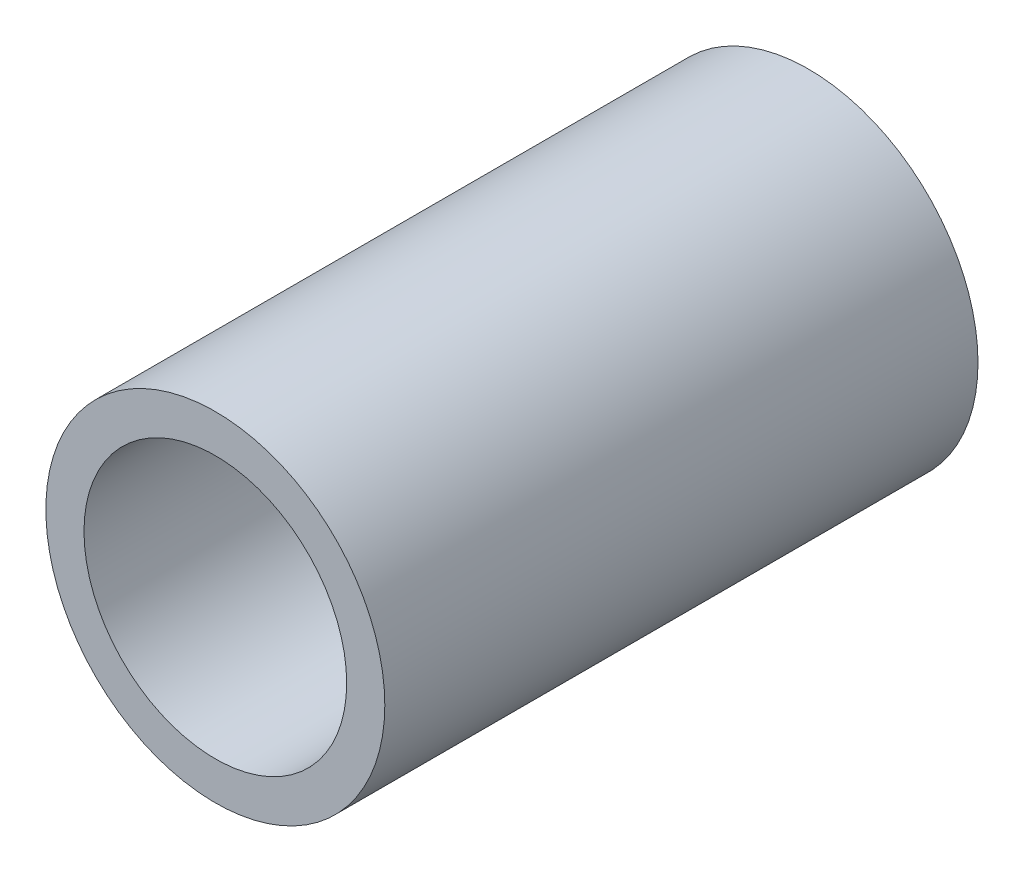
ISO-10303-21;
HEADER;
FILE_DESCRIPTION(('STEP AP214'),'2;1');
FILE_NAME('part.step','',(''),(''),'','','');
FILE_SCHEMA(('AUTOMOTIVE_DESIGN { 1 0 10303 214 1 1 1 1 }'));
ENDSEC;
DATA;
#1=APPLICATION_CONTEXT('core data for automotive mechanical design processes');
#2=APPLICATION_PROTOCOL_DEFINITION('international standard','automotive_design',2000,#1);
#3=PRODUCT_CONTEXT('',#1,'mechanical');
#4=PRODUCT('Part','Part','',(#3));
#5=PRODUCT_RELATED_PRODUCT_CATEGORY('part','',(#4));
#6=PRODUCT_DEFINITION_FORMATION('','',#4);
#7=PRODUCT_DEFINITION_CONTEXT('part definition',#1,'design');
#8=PRODUCT_DEFINITION('design','',#6,#7);
#9=PRODUCT_DEFINITION_SHAPE('','',#8);
#10=(LENGTH_UNIT() NAMED_UNIT(*) SI_UNIT(.MILLI.,.METRE.));
#11=(NAMED_UNIT(*) PLANE_ANGLE_UNIT() SI_UNIT($,.RADIAN.));
#12=(NAMED_UNIT(*) SI_UNIT($,.STERADIAN.) SOLID_ANGLE_UNIT());
#13=UNCERTAINTY_MEASURE_WITH_UNIT(LENGTH_MEASURE(1.E-05),#10,'distance_accuracy_value','');
#14=(GEOMETRIC_REPRESENTATION_CONTEXT(3) GLOBAL_UNCERTAINTY_ASSIGNED_CONTEXT((#13)) GLOBAL_UNIT_ASSIGNED_CONTEXT((#10,
#11,#12)) REPRESENTATION_CONTEXT('',''));
#15=CARTESIAN_POINT('',(0.,0.,0.));
#16=DIRECTION('',(0.,0.,1.));
#17=DIRECTION('',(1.,0.,0.));
#18=AXIS2_PLACEMENT_3D('',#15,#16,#17);
#19=CARTESIAN_POINT('',(0.,0.,3.5));
#20=DIRECTION('',(0.,0.,1.));
#21=DIRECTION('',(1.,0.,0.));
#22=AXIS2_PLACEMENT_3D('',#19,#20,#21);
#23=PLANE('',#22);
#24=CARTESIAN_POINT('',(0.,0.,3.5));
#25=DIRECTION('',(0.,0.,1.));
#26=DIRECTION('',(1.,0.,0.));
#27=AXIS2_PLACEMENT_3D('',#24,#25,#26);
#28=CIRCLE('',#27,1.);
#29=CARTESIAN_POINT('',(1.,0.,3.5));
#30=VERTEX_POINT('',#29);
#31=EDGE_CURVE('E10',#30,#30,#28,.T.);
#32=ORIENTED_EDGE('',*,*,#31,.T.);
#33=EDGE_LOOP('',(#32));
#34=FACE_BOUND('',#33,.T.);
#35=CARTESIAN_POINT('',(0.,0.,3.5));
#36=DIRECTION('',(0.,0.,1.));
#37=DIRECTION('',(1.,0.,0.));
#38=AXIS2_PLACEMENT_3D('',#35,#36,#37);
#39=CIRCLE('',#38,0.775);
#40=CARTESIAN_POINT('',(0.775,0.,3.5));
#41=VERTEX_POINT('',#40);
#42=EDGE_CURVE('E46',#41,#41,#39,.T.);
#43=ORIENTED_EDGE('',*,*,#42,.F.);
#44=EDGE_LOOP('',(#43));
#45=FACE_BOUND('',#44,.T.);
#46=ADVANCED_FACE('F35',(#34,#45),#23,.T.);
#47=CARTESIAN_POINT('',(0.,0.,0.));
#48=DIRECTION('',(0.,0.,1.));
#49=DIRECTION('',(1.,0.,0.));
#50=AXIS2_PLACEMENT_3D('',#47,#48,#49);
#51=PLANE('',#50);
#52=CARTESIAN_POINT('',(0.,0.,0.));
#53=DIRECTION('',(0.,0.,1.));
#54=DIRECTION('',(1.,0.,0.));
#55=AXIS2_PLACEMENT_3D('',#52,#53,#54);
#56=CIRCLE('',#55,1.);
#57=CARTESIAN_POINT('',(1.,0.,0.));
#58=VERTEX_POINT('',#57);
#59=EDGE_CURVE('E39',#58,#58,#56,.T.);
#60=ORIENTED_EDGE('',*,*,#59,.F.);
#61=EDGE_LOOP('',(#60));
#62=FACE_BOUND('',#61,.T.);
#63=CARTESIAN_POINT('',(0.,0.,0.));
#64=DIRECTION('',(0.,0.,1.));
#65=DIRECTION('',(1.,0.,0.));
#66=AXIS2_PLACEMENT_3D('',#63,#64,#65);
#67=CIRCLE('',#66,0.775);
#68=CARTESIAN_POINT('',(0.775,0.,0.));
#69=VERTEX_POINT('',#68);
#70=EDGE_CURVE('E48',#69,#69,#67,.T.);
#71=ORIENTED_EDGE('',*,*,#70,.T.);
#72=EDGE_LOOP('',(#71));
#73=FACE_BOUND('',#72,.T.);
#74=ADVANCED_FACE('F58',(#62,#73),#51,.F.);
#75=CARTESIAN_POINT('',(0.,0.,3.5));
#76=DIRECTION('',(0.,0.,-1.));
#77=DIRECTION('',(-1.,0.,0.));
#78=AXIS2_PLACEMENT_3D('',#75,#76,#77);
#79=CYLINDRICAL_SURFACE('',#78,1.);
#80=ORIENTED_EDGE('',*,*,#31,.F.);
#81=EDGE_LOOP('',(#80));
#82=FACE_BOUND('',#81,.T.);
#83=ORIENTED_EDGE('',*,*,#59,.T.);
#84=EDGE_LOOP('',(#83));
#85=FACE_BOUND('',#84,.T.);
#86=ADVANCED_FACE('F37',(#82,#85),#79,.T.);
#87=CARTESIAN_POINT('',(0.,0.,3.5));
#88=DIRECTION('',(0.,0.,-1.));
#89=DIRECTION('',(-1.,0.,0.));
#90=AXIS2_PLACEMENT_3D('',#87,#88,#89);
#91=CYLINDRICAL_SURFACE('',#90,0.775);
#92=ORIENTED_EDGE('',*,*,#42,.T.);
#93=EDGE_LOOP('',(#92));
#94=FACE_BOUND('',#93,.T.);
#95=ORIENTED_EDGE('',*,*,#70,.F.);
#96=EDGE_LOOP('',(#95));
#97=FACE_BOUND('',#96,.T.);
#98=ADVANCED_FACE('F54',(#94,#97),#91,.F.);
#99=CLOSED_SHELL('',(#46,#74,#86,#98));
#100=MANIFOLD_SOLID_BREP('B2',#99);
#101=ADVANCED_BREP_SHAPE_REPRESENTATION('',(#18,#100),#14);
#102=SHAPE_DEFINITION_REPRESENTATION(#9,#101);
ENDSEC;
END-ISO-10303-21;
